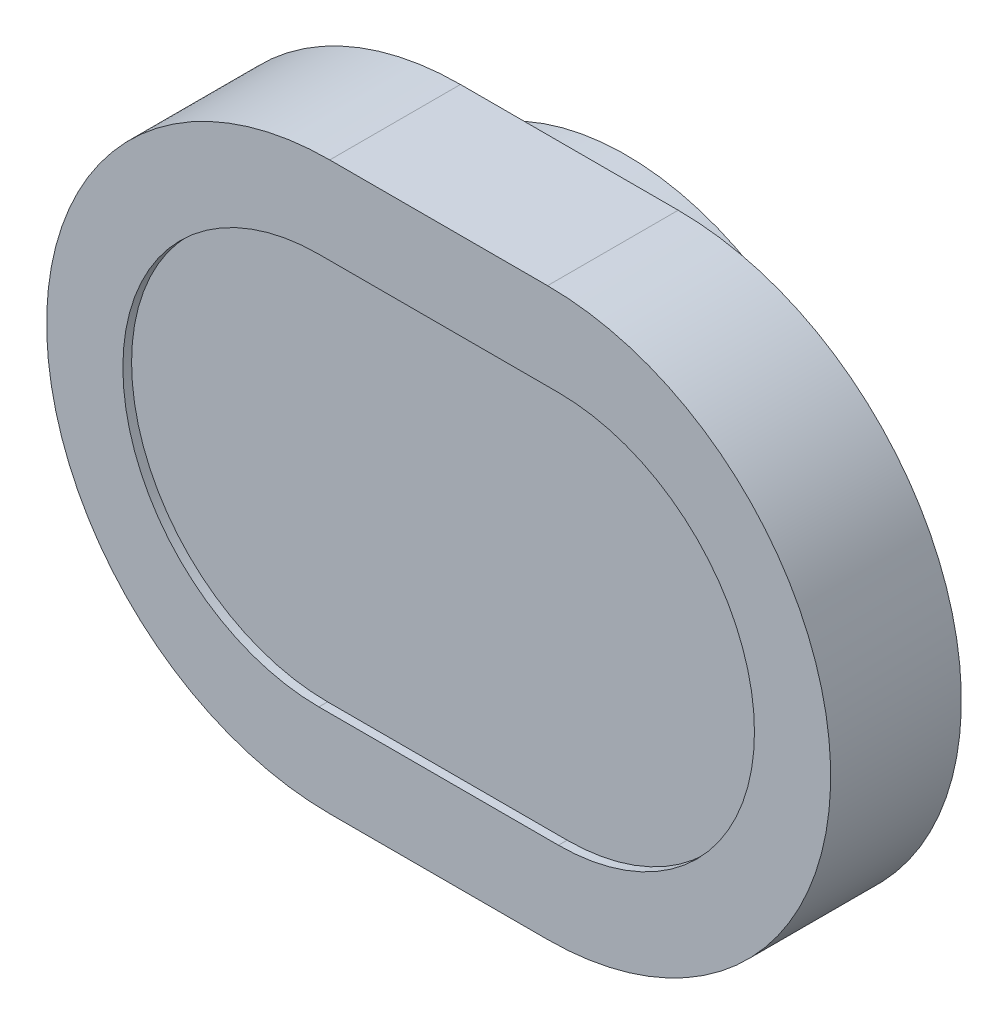
ISO-10303-21;
HEADER;
FILE_DESCRIPTION(('STEP AP214'),'2;1');
FILE_NAME('part.step','',(''),(''),'','','');
FILE_SCHEMA(('AUTOMOTIVE_DESIGN { 1 0 10303 214 1 1 1 1 }'));
ENDSEC;
DATA;
#1=APPLICATION_CONTEXT('core data for automotive mechanical design processes');
#2=APPLICATION_PROTOCOL_DEFINITION('international standard','automotive_design',2000,#1);
#3=PRODUCT_CONTEXT('',#1,'mechanical');
#4=PRODUCT('Part','Part','',(#3));
#5=PRODUCT_RELATED_PRODUCT_CATEGORY('part','',(#4));
#6=PRODUCT_DEFINITION_FORMATION('','',#4);
#7=PRODUCT_DEFINITION_CONTEXT('part definition',#1,'design');
#8=PRODUCT_DEFINITION('design','',#6,#7);
#9=PRODUCT_DEFINITION_SHAPE('','',#8);
#10=(LENGTH_UNIT() NAMED_UNIT(*) SI_UNIT(.MILLI.,.METRE.));
#11=(NAMED_UNIT(*) PLANE_ANGLE_UNIT() SI_UNIT($,.RADIAN.));
#12=(NAMED_UNIT(*) SI_UNIT($,.STERADIAN.) SOLID_ANGLE_UNIT());
#13=UNCERTAINTY_MEASURE_WITH_UNIT(LENGTH_MEASURE(1.E-05),#10,'distance_accuracy_value','');
#14=(GEOMETRIC_REPRESENTATION_CONTEXT(3) GLOBAL_UNCERTAINTY_ASSIGNED_CONTEXT((#13)) GLOBAL_UNIT_ASSIGNED_CONTEXT((#10,
#11,#12)) REPRESENTATION_CONTEXT('',''));
#15=CARTESIAN_POINT('',(0.,0.,0.));
#16=DIRECTION('',(0.,0.,1.));
#17=DIRECTION('',(1.,0.,0.));
#18=AXIS2_PLACEMENT_3D('',#15,#16,#17);
#19=CARTESIAN_POINT('',(0.,0.,1.3));
#20=DIRECTION('',(0.,0.,-1.));
#21=DIRECTION('',(-1.,0.,0.));
#22=AXIS2_PLACEMENT_3D('',#19,#20,#21);
#23=CYLINDRICAL_SURFACE('',#22,5.7);
#24=CARTESIAN_POINT('',(0.,0.,1.3));
#25=DIRECTION('',(0.,0.,1.));
#26=DIRECTION('',(1.,0.,0.));
#27=AXIS2_PLACEMENT_3D('',#24,#25,#26);
#28=CIRCLE('',#27,5.7);
#29=CARTESIAN_POINT('',(5.7,0.,1.3));
#30=VERTEX_POINT('',#29);
#31=EDGE_CURVE('E11',#30,#30,#28,.T.);
#32=ORIENTED_EDGE('',*,*,#31,.F.);
#33=EDGE_LOOP('',(#32));
#34=FACE_BOUND('',#33,.T.);
#35=CARTESIAN_POINT('',(0.,0.,0.));
#36=DIRECTION('',(0.,0.,1.));
#37=DIRECTION('',(1.,0.,0.));
#38=AXIS2_PLACEMENT_3D('',#35,#36,#37);
#39=CIRCLE('',#38,5.7);
#40=CARTESIAN_POINT('',(5.7,0.,0.));
#41=VERTEX_POINT('',#40);
#42=EDGE_CURVE('E42',#41,#41,#39,.T.);
#43=ORIENTED_EDGE('',*,*,#42,.T.);
#44=EDGE_LOOP('',(#43));
#45=FACE_BOUND('',#44,.T.);
#46=ADVANCED_FACE('F39',(#34,#45),#23,.T.);
#47=CARTESIAN_POINT('',(0.,0.,0.));
#48=DIRECTION('',(0.,0.,1.));
#49=DIRECTION('',(1.,0.,0.));
#50=AXIS2_PLACEMENT_3D('',#47,#48,#49);
#51=PLANE('',#50);
#52=ORIENTED_EDGE('',*,*,#42,.F.);
#53=EDGE_LOOP('',(#52));
#54=FACE_BOUND('',#53,.T.);
#55=ADVANCED_FACE('F176',(#54),#51,.F.);
#56=CARTESIAN_POINT('',(-2.50000000000001,0.,4.1));
#57=DIRECTION('',(0.,0.,-1.));
#58=DIRECTION('',(-1.,0.,0.));
#59=AXIS2_PLACEMENT_3D('',#56,#57,#58);
#60=CYLINDRICAL_SURFACE('',#59,6.5);
#61=CARTESIAN_POINT('',(-2.50000000000001,0.,1.3));
#62=DIRECTION('',(0.,0.,1.));
#63=DIRECTION('',(1.,0.,0.));
#64=AXIS2_PLACEMENT_3D('',#61,#62,#63);
#65=CIRCLE('',#64,6.5);
#66=CARTESIAN_POINT('',(-2.50000000000001,6.5,1.3));
#67=VERTEX_POINT('',#66);
#68=CARTESIAN_POINT('',(-2.5,-6.5,1.3));
#69=VERTEX_POINT('',#68);
#70=EDGE_CURVE('E150',#67,#69,#65,.T.);
#71=ORIENTED_EDGE('',*,*,#70,.T.);
#72=DIRECTION('',(0.,0.,-1.));
#73=VECTOR('',#72,1.);
#74=CARTESIAN_POINT('',(-2.5,-6.5,4.1));
#75=LINE('',#74,#73);
#76=CARTESIAN_POINT('',(-2.50000000000001,-6.5,4.3));
#77=VERTEX_POINT('',#76);
#78=EDGE_CURVE('E168',#77,#69,#75,.T.);
#79=ORIENTED_EDGE('',*,*,#78,.F.);
#80=CARTESIAN_POINT('',(-2.50000000000001,0.,4.3));
#81=DIRECTION('',(0.,0.,1.));
#82=DIRECTION('',(1.,0.,0.));
#83=AXIS2_PLACEMENT_3D('',#80,#81,#82);
#84=CIRCLE('',#83,6.5);
#85=CARTESIAN_POINT('',(-2.50000000000001,6.5,4.3));
#86=VERTEX_POINT('',#85);
#87=EDGE_CURVE('E117',#86,#77,#84,.T.);
#88=ORIENTED_EDGE('',*,*,#87,.F.);
#89=DIRECTION('',(0.,0.,-1.));
#90=VECTOR('',#89,1.);
#91=CARTESIAN_POINT('',(-2.50000000000001,6.5,4.1));
#92=LINE('',#91,#90);
#93=EDGE_CURVE('E159',#86,#67,#92,.T.);
#94=ORIENTED_EDGE('',*,*,#93,.T.);
#95=EDGE_LOOP('',(#71,#79,#88,#94));
#96=FACE_BOUND('',#95,.T.);
#97=ADVANCED_FACE('F178',(#96),#60,.T.);
#98=CARTESIAN_POINT('',(-2.5,-6.5,4.1));
#99=DIRECTION('',(0.,1.,0.));
#100=DIRECTION('',(0.,0.,1.));
#101=AXIS2_PLACEMENT_3D('',#98,#99,#100);
#102=PLANE('',#101);
#103=DIRECTION('',(1.,0.,0.));
#104=VECTOR('',#103,1.);
#105=CARTESIAN_POINT('',(-2.5,-6.5,1.3));
#106=LINE('',#105,#104);
#107=CARTESIAN_POINT('',(2.50000000000001,-6.5,1.3));
#108=VERTEX_POINT('',#107);
#109=EDGE_CURVE('E153',#69,#108,#106,.T.);
#110=ORIENTED_EDGE('',*,*,#109,.T.);
#111=DIRECTION('',(0.,0.,-1.));
#112=VECTOR('',#111,1.);
#113=CARTESIAN_POINT('',(2.50000000000001,-6.5,4.1));
#114=LINE('',#113,#112);
#115=CARTESIAN_POINT('',(2.50000000000001,-6.5,4.3));
#116=VERTEX_POINT('',#115);
#117=EDGE_CURVE('E165',#116,#108,#114,.T.);
#118=ORIENTED_EDGE('',*,*,#117,.F.);
#119=DIRECTION('',(1.,0.,0.));
#120=VECTOR('',#119,1.);
#121=CARTESIAN_POINT('',(-2.50000000000001,-6.5,4.3));
#122=LINE('',#121,#120);
#123=EDGE_CURVE('E141',#77,#116,#122,.T.);
#124=ORIENTED_EDGE('',*,*,#123,.F.);
#125=ORIENTED_EDGE('',*,*,#78,.T.);
#126=EDGE_LOOP('',(#110,#118,#124,#125));
#127=FACE_BOUND('',#126,.T.);
#128=ADVANCED_FACE('F183',(#127),#102,.F.);
#129=CARTESIAN_POINT('',(2.50000000000001,0.,4.1));
#130=DIRECTION('',(0.,0.,-1.));
#131=DIRECTION('',(-1.,0.,0.));
#132=AXIS2_PLACEMENT_3D('',#129,#130,#131);
#133=CYLINDRICAL_SURFACE('',#132,6.5);
#134=CARTESIAN_POINT('',(2.50000000000001,0.,1.3));
#135=DIRECTION('',(0.,0.,1.));
#136=DIRECTION('',(1.,0.,0.));
#137=AXIS2_PLACEMENT_3D('',#134,#135,#136);
#138=CIRCLE('',#137,6.5);
#139=CARTESIAN_POINT('',(2.50000000000001,6.5,1.3));
#140=VERTEX_POINT('',#139);
#141=EDGE_CURVE('E155',#108,#140,#138,.T.);
#142=ORIENTED_EDGE('',*,*,#141,.T.);
#143=DIRECTION('',(0.,0.,-1.));
#144=VECTOR('',#143,1.);
#145=CARTESIAN_POINT('',(2.50000000000001,6.5,4.1));
#146=LINE('',#145,#144);
#147=CARTESIAN_POINT('',(2.50000000000001,6.5,4.3));
#148=VERTEX_POINT('',#147);
#149=EDGE_CURVE('E162',#148,#140,#146,.T.);
#150=ORIENTED_EDGE('',*,*,#149,.F.);
#151=CARTESIAN_POINT('',(2.50000000000001,0.,4.3));
#152=DIRECTION('',(0.,0.,1.));
#153=DIRECTION('',(1.,0.,0.));
#154=AXIS2_PLACEMENT_3D('',#151,#152,#153);
#155=CIRCLE('',#154,6.5);
#156=EDGE_CURVE('E144',#116,#148,#155,.T.);
#157=ORIENTED_EDGE('',*,*,#156,.F.);
#158=ORIENTED_EDGE('',*,*,#117,.T.);
#159=EDGE_LOOP('',(#142,#150,#157,#158));
#160=FACE_BOUND('',#159,.T.);
#161=ADVANCED_FACE('F190',(#160),#133,.T.);
#162=CARTESIAN_POINT('',(-2.50000000000001,6.5,4.1));
#163=DIRECTION('',(0.,-1.,0.));
#164=DIRECTION('',(0.,0.,-1.));
#165=AXIS2_PLACEMENT_3D('',#162,#163,#164);
#166=PLANE('',#165);
#167=DIRECTION('',(-1.,0.,0.));
#168=VECTOR('',#167,1.);
#169=CARTESIAN_POINT('',(-2.50000000000001,6.5,1.3));
#170=LINE('',#169,#168);
#171=EDGE_CURVE('E157',#140,#67,#170,.T.);
#172=ORIENTED_EDGE('',*,*,#171,.T.);
#173=ORIENTED_EDGE('',*,*,#93,.F.);
#174=DIRECTION('',(-1.,0.,0.));
#175=VECTOR('',#174,1.);
#176=CARTESIAN_POINT('',(-2.50000000000001,6.5,4.3));
#177=LINE('',#176,#175);
#178=EDGE_CURVE('E147',#148,#86,#177,.T.);
#179=ORIENTED_EDGE('',*,*,#178,.F.);
#180=ORIENTED_EDGE('',*,*,#149,.T.);
#181=EDGE_LOOP('',(#172,#173,#179,#180));
#182=FACE_BOUND('',#181,.T.);
#183=ADVANCED_FACE('F193',(#182),#166,.F.);
#184=CARTESIAN_POINT('',(-2.50000000000001,0.,1.3));
#185=DIRECTION('',(0.,0.,1.));
#186=DIRECTION('',(1.,0.,0.));
#187=AXIS2_PLACEMENT_3D('',#184,#185,#186);
#188=PLANE('',#187);
#189=ORIENTED_EDGE('',*,*,#31,.T.);
#190=EDGE_LOOP('',(#189));
#191=FACE_BOUND('',#190,.T.);
#192=ORIENTED_EDGE('',*,*,#70,.F.);
#193=ORIENTED_EDGE('',*,*,#171,.F.);
#194=ORIENTED_EDGE('',*,*,#141,.F.);
#195=ORIENTED_EDGE('',*,*,#109,.F.);
#196=EDGE_LOOP('',(#192,#193,#194,#195));
#197=FACE_BOUND('',#196,.T.);
#198=ADVANCED_FACE('F197',(#191,#197),#188,.F.);
#199=CARTESIAN_POINT('',(-2.50000000000001,0.,4.3));
#200=DIRECTION('',(0.,0.,1.));
#201=DIRECTION('',(1.,0.,0.));
#202=AXIS2_PLACEMENT_3D('',#199,#200,#201);
#203=PLANE('',#202);
#204=ORIENTED_EDGE('',*,*,#87,.T.);
#205=ORIENTED_EDGE('',*,*,#123,.T.);
#206=ORIENTED_EDGE('',*,*,#156,.T.);
#207=ORIENTED_EDGE('',*,*,#178,.T.);
#208=EDGE_LOOP('',(#204,#205,#206,#207));
#209=FACE_BOUND('',#208,.T.);
#210=DIRECTION('',(1.,0.,0.));
#211=VECTOR('',#210,1.);
#212=CARTESIAN_POINT('',(-2.75,-4.5,4.3));
#213=LINE('',#212,#211);
#214=CARTESIAN_POINT('',(-2.75,-4.5,4.3));
#215=VERTEX_POINT('',#214);
#216=CARTESIAN_POINT('',(2.75,-4.5,4.3));
#217=VERTEX_POINT('',#216);
#218=EDGE_CURVE('E111',#215,#217,#213,.T.);
#219=ORIENTED_EDGE('',*,*,#218,.F.);
#220=CARTESIAN_POINT('',(-2.75,0.,4.3));
#221=DIRECTION('',(0.,0.,1.));
#222=DIRECTION('',(1.,0.,0.));
#223=AXIS2_PLACEMENT_3D('',#220,#221,#222);
#224=CIRCLE('',#223,4.5);
#225=CARTESIAN_POINT('',(-2.75,4.5,4.3));
#226=VERTEX_POINT('',#225);
#227=EDGE_CURVE('E102',#226,#215,#224,.T.);
#228=ORIENTED_EDGE('',*,*,#227,.F.);
#229=DIRECTION('',(-1.,0.,0.));
#230=VECTOR('',#229,1.);
#231=CARTESIAN_POINT('',(-2.75,4.5,4.3));
#232=LINE('',#231,#230);
#233=CARTESIAN_POINT('',(2.75,4.5,4.3));
#234=VERTEX_POINT('',#233);
#235=EDGE_CURVE('E125',#234,#226,#232,.T.);
#236=ORIENTED_EDGE('',*,*,#235,.F.);
#237=CARTESIAN_POINT('',(2.75,0.,4.3));
#238=DIRECTION('',(0.,0.,1.));
#239=DIRECTION('',(1.,0.,0.));
#240=AXIS2_PLACEMENT_3D('',#237,#238,#239);
#241=CIRCLE('',#240,4.5);
#242=EDGE_CURVE('E123',#217,#234,#241,.T.);
#243=ORIENTED_EDGE('',*,*,#242,.F.);
#244=EDGE_LOOP('',(#219,#228,#236,#243));
#245=FACE_BOUND('',#244,.T.);
#246=ADVANCED_FACE('F121',(#209,#245),#203,.T.);
#247=CARTESIAN_POINT('',(-2.75,0.,4.3));
#248=DIRECTION('',(0.,0.,-1.));
#249=DIRECTION('',(-1.,0.,0.));
#250=AXIS2_PLACEMENT_3D('',#247,#248,#249);
#251=CYLINDRICAL_SURFACE('',#250,4.5);
#252=CARTESIAN_POINT('',(-2.75,0.,4.1));
#253=DIRECTION('',(0.,0.,1.));
#254=DIRECTION('',(1.,0.,0.));
#255=AXIS2_PLACEMENT_3D('',#252,#253,#254);
#256=CIRCLE('',#255,4.5);
#257=CARTESIAN_POINT('',(-2.75,4.5,4.1));
#258=VERTEX_POINT('',#257);
#259=CARTESIAN_POINT('',(-2.75,-4.5,4.1));
#260=VERTEX_POINT('',#259);
#261=EDGE_CURVE('E53',#258,#260,#256,.T.);
#262=ORIENTED_EDGE('',*,*,#261,.F.);
#263=DIRECTION('',(0.,0.,-1.));
#264=VECTOR('',#263,1.);
#265=CARTESIAN_POINT('',(-2.75,4.5,4.3));
#266=LINE('',#265,#264);
#267=EDGE_CURVE('E107',#226,#258,#266,.T.);
#268=ORIENTED_EDGE('',*,*,#267,.F.);
#269=ORIENTED_EDGE('',*,*,#227,.T.);
#270=DIRECTION('',(0.,0.,-1.));
#271=VECTOR('',#270,1.);
#272=CARTESIAN_POINT('',(-2.75,-4.5,4.3));
#273=LINE('',#272,#271);
#274=EDGE_CURVE('E105',#215,#260,#273,.T.);
#275=ORIENTED_EDGE('',*,*,#274,.T.);
#276=EDGE_LOOP('',(#262,#268,#269,#275));
#277=FACE_BOUND('',#276,.T.);
#278=ADVANCED_FACE('F104',(#277),#251,.F.);
#279=CARTESIAN_POINT('',(-2.75,-4.5,4.3));
#280=DIRECTION('',(0.,1.,0.));
#281=DIRECTION('',(0.,0.,1.));
#282=AXIS2_PLACEMENT_3D('',#279,#280,#281);
#283=PLANE('',#282);
#284=DIRECTION('',(1.,0.,0.));
#285=VECTOR('',#284,1.);
#286=CARTESIAN_POINT('',(-2.75,-4.5,4.1));
#287=LINE('',#286,#285);
#288=CARTESIAN_POINT('',(2.75,-4.5,4.1));
#289=VERTEX_POINT('',#288);
#290=EDGE_CURVE('E57',#260,#289,#287,.T.);
#291=ORIENTED_EDGE('',*,*,#290,.F.);
#292=ORIENTED_EDGE('',*,*,#274,.F.);
#293=ORIENTED_EDGE('',*,*,#218,.T.);
#294=DIRECTION('',(0.,0.,-1.));
#295=VECTOR('',#294,1.);
#296=CARTESIAN_POINT('',(2.75,-4.5,4.3));
#297=LINE('',#296,#295);
#298=EDGE_CURVE('E118',#217,#289,#297,.T.);
#299=ORIENTED_EDGE('',*,*,#298,.T.);
#300=EDGE_LOOP('',(#291,#292,#293,#299));
#301=FACE_BOUND('',#300,.T.);
#302=ADVANCED_FACE('F115',(#301),#283,.T.);
#303=CARTESIAN_POINT('',(2.75,0.,4.3));
#304=DIRECTION('',(0.,0.,-1.));
#305=DIRECTION('',(-1.,0.,0.));
#306=AXIS2_PLACEMENT_3D('',#303,#304,#305);
#307=CYLINDRICAL_SURFACE('',#306,4.5);
#308=CARTESIAN_POINT('',(2.75,0.,4.1));
#309=DIRECTION('',(0.,0.,1.));
#310=DIRECTION('',(1.,0.,0.));
#311=AXIS2_PLACEMENT_3D('',#308,#309,#310);
#312=CIRCLE('',#311,4.5);
#313=CARTESIAN_POINT('',(2.75,4.5,4.1));
#314=VERTEX_POINT('',#313);
#315=EDGE_CURVE('E131',#289,#314,#312,.T.);
#316=ORIENTED_EDGE('',*,*,#315,.F.);
#317=ORIENTED_EDGE('',*,*,#298,.F.);
#318=ORIENTED_EDGE('',*,*,#242,.T.);
#319=DIRECTION('',(0.,0.,-1.));
#320=VECTOR('',#319,1.);
#321=CARTESIAN_POINT('',(2.75,4.5,4.3));
#322=LINE('',#321,#320);
#323=EDGE_CURVE('E135',#234,#314,#322,.T.);
#324=ORIENTED_EDGE('',*,*,#323,.T.);
#325=EDGE_LOOP('',(#316,#317,#318,#324));
#326=FACE_BOUND('',#325,.T.);
#327=ADVANCED_FACE('F213',(#326),#307,.F.);
#328=CARTESIAN_POINT('',(-2.75,4.5,4.3));
#329=DIRECTION('',(0.,-1.,0.));
#330=DIRECTION('',(0.,0.,-1.));
#331=AXIS2_PLACEMENT_3D('',#328,#329,#330);
#332=PLANE('',#331);
#333=DIRECTION('',(-1.,0.,0.));
#334=VECTOR('',#333,1.);
#335=CARTESIAN_POINT('',(-2.75,4.5,4.1));
#336=LINE('',#335,#334);
#337=EDGE_CURVE('E112',#314,#258,#336,.T.);
#338=ORIENTED_EDGE('',*,*,#337,.F.);
#339=ORIENTED_EDGE('',*,*,#323,.F.);
#340=ORIENTED_EDGE('',*,*,#235,.T.);
#341=ORIENTED_EDGE('',*,*,#267,.T.);
#342=EDGE_LOOP('',(#338,#339,#340,#341));
#343=FACE_BOUND('',#342,.T.);
#344=ADVANCED_FACE('F205',(#343),#332,.T.);
#345=CARTESIAN_POINT('',(-2.50000000000001,0.,4.1));
#346=DIRECTION('',(0.,0.,1.));
#347=DIRECTION('',(1.,0.,0.));
#348=AXIS2_PLACEMENT_3D('',#345,#346,#347);
#349=PLANE('',#348);
#350=ORIENTED_EDGE('',*,*,#261,.T.);
#351=ORIENTED_EDGE('',*,*,#290,.T.);
#352=ORIENTED_EDGE('',*,*,#315,.T.);
#353=ORIENTED_EDGE('',*,*,#337,.T.);
#354=EDGE_LOOP('',(#350,#351,#352,#353));
#355=FACE_BOUND('',#354,.T.);
#356=ADVANCED_FACE('F202',(#355),#349,.T.);
#357=CLOSED_SHELL('',(#46,#55,#97,#128,#161,#183,#198,#246,#278,#302,#327,#344,#356));
#358=MANIFOLD_SOLID_BREP('B2',#357);
#359=ADVANCED_BREP_SHAPE_REPRESENTATION('',(#18,#358),#14);
#360=SHAPE_DEFINITION_REPRESENTATION(#9,#359);
ENDSEC;
END-ISO-10303-21;
